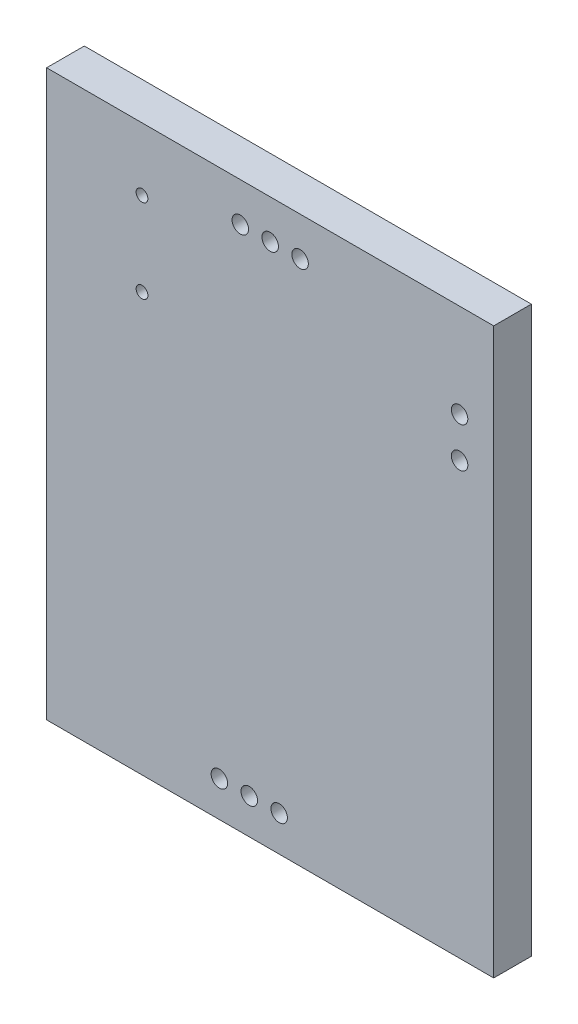
ISO-10303-21;
HEADER;
FILE_DESCRIPTION(('STEP AP214'),'2;1');
FILE_NAME('part.step','',(''),(''),'','','');
FILE_SCHEMA(('AUTOMOTIVE_DESIGN { 1 0 10303 214 1 1 1 1 }'));
ENDSEC;
DATA;
#1=APPLICATION_CONTEXT('core data for automotive mechanical design processes');
#2=APPLICATION_PROTOCOL_DEFINITION('international standard','automotive_design',2000,#1);
#3=PRODUCT_CONTEXT('',#1,'mechanical');
#4=PRODUCT('Part','Part','',(#3));
#5=PRODUCT_RELATED_PRODUCT_CATEGORY('part','',(#4));
#6=PRODUCT_DEFINITION_FORMATION('','',#4);
#7=PRODUCT_DEFINITION_CONTEXT('part definition',#1,'design');
#8=PRODUCT_DEFINITION('design','',#6,#7);
#9=PRODUCT_DEFINITION_SHAPE('','',#8);
#10=(LENGTH_UNIT() NAMED_UNIT(*) SI_UNIT(.MILLI.,.METRE.));
#11=(NAMED_UNIT(*) PLANE_ANGLE_UNIT() SI_UNIT($,.RADIAN.));
#12=(NAMED_UNIT(*) SI_UNIT($,.STERADIAN.) SOLID_ANGLE_UNIT());
#13=UNCERTAINTY_MEASURE_WITH_UNIT(LENGTH_MEASURE(1.E-05),#10,'distance_accuracy_value','');
#14=(GEOMETRIC_REPRESENTATION_CONTEXT(3) GLOBAL_UNCERTAINTY_ASSIGNED_CONTEXT((#13)) GLOBAL_UNIT_ASSIGNED_CONTEXT((#10,
#11,#12)) REPRESENTATION_CONTEXT('',''));
#15=CARTESIAN_POINT('',(0.,0.,0.));
#16=DIRECTION('',(0.,0.,1.));
#17=DIRECTION('',(1.,0.,0.));
#18=AXIS2_PLACEMENT_3D('',#15,#16,#17);
#19=CARTESIAN_POINT('',(19.668039116078,-21.2632029464,1.600050800102));
#20=DIRECTION('',(0.,0.,-1.));
#21=DIRECTION('',(-1.,0.,0.));
#22=AXIS2_PLACEMENT_3D('',#19,#20,#21);
#23=PLANE('',#22);
#24=CARTESIAN_POINT('',(27.714503429007,-14.94716789433,1.600050800102));
#25=DIRECTION('',(0.,0.,-1.));
#26=DIRECTION('',(-1.,0.,0.));
#27=AXIS2_PLACEMENT_3D('',#24,#25,#26);
#28=CIRCLE('',#27,0.350012700025);
#29=CARTESIAN_POINT('',(27.364490728982,-14.94716789433,1.600050800102));
#30=VERTEX_POINT('',#29);
#31=EDGE_CURVE('E108',#30,#30,#28,.T.);
#32=ORIENTED_EDGE('',*,*,#31,.T.);
#33=EDGE_LOOP('',(#32));
#34=FACE_BOUND('',#33,.T.);
#35=CARTESIAN_POINT('',(27.714503429007,-13.24714249428,1.600050800102));
#36=DIRECTION('',(0.,0.,-1.));
#37=DIRECTION('',(-1.,0.,0.));
#38=AXIS2_PLACEMENT_3D('',#35,#36,#37);
#39=CIRCLE('',#38,0.350012700025);
#40=CARTESIAN_POINT('',(27.364490728982,-13.24714249428,1.600050800102));
#41=VERTEX_POINT('',#40);
#42=EDGE_CURVE('E112',#41,#41,#39,.T.);
#43=ORIENTED_EDGE('',*,*,#42,.T.);
#44=EDGE_LOOP('',(#43));
#45=FACE_BOUND('',#44,.T.);
#46=CARTESIAN_POINT('',(20.939057658115,-10.92202184404,1.600050800102));
#47=DIRECTION('',(0.,0.,-1.));
#48=DIRECTION('',(-1.,0.,0.));
#49=AXIS2_PLACEMENT_3D('',#46,#47,#48);
#50=CIRCLE('',#49,0.350012700025);
#51=CARTESIAN_POINT('',(20.58904495809,-10.92202184404,1.600050800102));
#52=VERTEX_POINT('',#51);
#53=EDGE_CURVE('E115',#52,#52,#50,.T.);
#54=ORIENTED_EDGE('',*,*,#53,.T.);
#55=EDGE_LOOP('',(#54));
#56=FACE_BOUND('',#55,.T.);
#57=CARTESIAN_POINT('',(20.0508001016,-31.75006350012,1.600050800102));
#58=DIRECTION('',(0.,0.,-1.));
#59=DIRECTION('',(-1.,0.,0.));
#60=AXIS2_PLACEMENT_3D('',#57,#58,#59);
#61=CIRCLE('',#60,0.350012700025);
#62=CARTESIAN_POINT('',(19.700787401575,-31.75006350012,1.600050800102));
#63=VERTEX_POINT('',#62);
#64=EDGE_CURVE('E118',#63,#63,#61,.T.);
#65=ORIENTED_EDGE('',*,*,#64,.T.);
#66=EDGE_LOOP('',(#65));
#67=FACE_BOUND('',#66,.T.);
#68=CARTESIAN_POINT('',(19.66905511811,-10.92202184404,1.600050800102));
#69=DIRECTION('',(0.,0.,-1.));
#70=DIRECTION('',(-1.,0.,0.));
#71=AXIS2_PLACEMENT_3D('',#68,#69,#70);
#72=CIRCLE('',#71,0.350012700025);
#73=CARTESIAN_POINT('',(19.319042418085,-10.92202184404,1.600050800102));
#74=VERTEX_POINT('',#73);
#75=EDGE_CURVE('E121',#74,#74,#72,.T.);
#76=ORIENTED_EDGE('',*,*,#75,.T.);
#77=EDGE_LOOP('',(#76));
#78=FACE_BOUND('',#77,.T.);
#79=CARTESIAN_POINT('',(18.780797561595,-31.75006350012,1.600050800102));
#80=DIRECTION('',(0.,0.,-1.));
#81=DIRECTION('',(-1.,0.,0.));
#82=AXIS2_PLACEMENT_3D('',#79,#80,#81);
#83=CIRCLE('',#82,0.350012700025);
#84=CARTESIAN_POINT('',(18.43078486157,-31.75006350012,1.600050800102));
#85=VERTEX_POINT('',#84);
#86=EDGE_CURVE('E124',#85,#85,#83,.T.);
#87=ORIENTED_EDGE('',*,*,#86,.T.);
#88=EDGE_LOOP('',(#87));
#89=FACE_BOUND('',#88,.T.);
#90=CARTESIAN_POINT('',(18.399052578105,-10.92202184404,1.600050800102));
#91=DIRECTION('',(0.,0.,-1.));
#92=DIRECTION('',(-1.,0.,0.));
#93=AXIS2_PLACEMENT_3D('',#90,#91,#92);
#94=CIRCLE('',#93,0.350012700025);
#95=CARTESIAN_POINT('',(18.04903987808,-10.92202184404,1.600050800102));
#96=VERTEX_POINT('',#95);
#97=EDGE_CURVE('E127',#96,#96,#94,.T.);
#98=ORIENTED_EDGE('',*,*,#97,.T.);
#99=EDGE_LOOP('',(#98));
#100=FACE_BOUND('',#99,.T.);
#101=CARTESIAN_POINT('',(17.51079502159,-31.75006350012,1.600050800102));
#102=DIRECTION('',(0.,0.,-1.));
#103=DIRECTION('',(-1.,0.,0.));
#104=AXIS2_PLACEMENT_3D('',#101,#102,#103);
#105=CIRCLE('',#104,0.350012700025);
#106=CARTESIAN_POINT('',(17.160782321565,-31.75006350012,1.600050800102));
#107=VERTEX_POINT('',#106);
#108=EDGE_CURVE('E130',#107,#107,#105,.T.);
#109=ORIENTED_EDGE('',*,*,#108,.T.);
#110=EDGE_LOOP('',(#109));
#111=FACE_BOUND('',#110,.T.);
#112=CARTESIAN_POINT('',(14.224028448057,-15.49403098806,1.600050800102));
#113=DIRECTION('',(0.,0.,-1.));
#114=DIRECTION('',(-1.,0.,0.));
#115=AXIS2_PLACEMENT_3D('',#112,#113,#114);
#116=CIRCLE('',#115,0.25);
#117=CARTESIAN_POINT('',(13.974028448057,-15.49403098806,1.600050800102));
#118=VERTEX_POINT('',#117);
#119=EDGE_CURVE('E132',#118,#118,#116,.T.);
#120=ORIENTED_EDGE('',*,*,#119,.T.);
#121=EDGE_LOOP('',(#120));
#122=FACE_BOUND('',#121,.T.);
#123=CARTESIAN_POINT('',(14.224028448057,-11.93802387604,1.600050800102));
#124=DIRECTION('',(0.,0.,-1.));
#125=DIRECTION('',(-1.,0.,0.));
#126=AXIS2_PLACEMENT_3D('',#123,#124,#125);
#127=CIRCLE('',#126,0.25);
#128=CARTESIAN_POINT('',(13.974028448057,-11.93802387604,1.600050800102));
#129=VERTEX_POINT('',#128);
#130=EDGE_CURVE('E20',#129,#129,#127,.T.);
#131=ORIENTED_EDGE('',*,*,#130,.T.);
#132=EDGE_LOOP('',(#131));
#133=FACE_BOUND('',#132,.T.);
#134=DIRECTION('',(0.,1.,0.));
#135=VECTOR('',#134,1.);
#136=CARTESIAN_POINT('',(10.172720345441,-33.25836677673,1.600050800102));
#137=LINE('',#136,#135);
#138=CARTESIAN_POINT('',(10.172720345441,-33.25836677673,1.600050800102));
#139=VERTEX_POINT('',#138);
#140=CARTESIAN_POINT('',(10.172720345441,-9.268039116078,1.600050800102));
#141=VERTEX_POINT('',#140);
#142=EDGE_CURVE('E70',#139,#141,#137,.T.);
#143=ORIENTED_EDGE('',*,*,#142,.F.);
#144=DIRECTION('',(1.,0.,0.));
#145=VECTOR('',#144,1.);
#146=CARTESIAN_POINT('',(29.163357886716,-33.25836677673,1.600050800102));
#147=LINE('',#146,#145);
#148=CARTESIAN_POINT('',(29.163357886716,-33.25836677673,1.600050800102));
#149=VERTEX_POINT('',#148);
#150=EDGE_CURVE('E55',#149,#139,#147,.F.);
#151=ORIENTED_EDGE('',*,*,#150,.F.);
#152=DIRECTION('',(0.,1.,0.));
#153=VECTOR('',#152,1.);
#154=CARTESIAN_POINT('',(29.163357886716,-9.268039116078,1.600050800102));
#155=LINE('',#154,#153);
#156=CARTESIAN_POINT('',(29.163357886716,-9.268039116078,1.600050800102));
#157=VERTEX_POINT('',#156);
#158=EDGE_CURVE('E60',#157,#149,#155,.F.);
#159=ORIENTED_EDGE('',*,*,#158,.F.);
#160=DIRECTION('',(1.,0.,0.));
#161=VECTOR('',#160,1.);
#162=CARTESIAN_POINT('',(10.172720345441,-9.268039116078,1.600050800102));
#163=LINE('',#162,#161);
#164=EDGE_CURVE('E139',#141,#157,#163,.T.);
#165=ORIENTED_EDGE('',*,*,#164,.F.);
#166=EDGE_LOOP('',(#143,#151,#159,#165));
#167=FACE_BOUND('',#166,.T.);
#168=ADVANCED_FACE('F17',(#34,#45,#56,#67,#78,#89,#100,#111,#122,#133,#167),#23,.F.);
#169=CARTESIAN_POINT('',(29.163357886716,-9.268039116078,0.));
#170=DIRECTION('',(1.,0.,0.));
#171=DIRECTION('',(0.,0.,-1.));
#172=AXIS2_PLACEMENT_3D('',#169,#170,#171);
#173=PLANE('',#172);
#174=DIRECTION('',(0.,0.,-1.));
#175=VECTOR('',#174,1.);
#176=CARTESIAN_POINT('',(29.163357886716,-33.25836677673,0.));
#177=LINE('',#176,#175);
#178=CARTESIAN_POINT('',(29.163357886716,-33.25836677673,0.));
#179=VERTEX_POINT('',#178);
#180=EDGE_CURVE('E62',#179,#149,#177,.F.);
#181=ORIENTED_EDGE('',*,*,#180,.F.);
#182=DIRECTION('',(0.,1.,0.));
#183=VECTOR('',#182,1.);
#184=CARTESIAN_POINT('',(29.163357886716,-21.2632029464,0.));
#185=LINE('',#184,#183);
#186=CARTESIAN_POINT('',(29.163357886716,-9.268039116078,0.));
#187=VERTEX_POINT('',#186);
#188=EDGE_CURVE('E111',#187,#179,#185,.F.);
#189=ORIENTED_EDGE('',*,*,#188,.F.);
#190=DIRECTION('',(0.,0.,1.));
#191=VECTOR('',#190,1.);
#192=CARTESIAN_POINT('',(29.163357886716,-9.268039116078,0.));
#193=LINE('',#192,#191);
#194=EDGE_CURVE('E65',#157,#187,#193,.F.);
#195=ORIENTED_EDGE('',*,*,#194,.F.);
#196=ORIENTED_EDGE('',*,*,#158,.T.);
#197=EDGE_LOOP('',(#181,#189,#195,#196));
#198=FACE_BOUND('',#197,.T.);
#199=ADVANCED_FACE('F61',(#198),#173,.T.);
#200=CARTESIAN_POINT('',(29.163357886716,-33.25836677673,0.));
#201=DIRECTION('',(0.,-1.,0.));
#202=DIRECTION('',(0.,0.,-1.));
#203=AXIS2_PLACEMENT_3D('',#200,#201,#202);
#204=PLANE('',#203);
#205=DIRECTION('',(0.,0.,1.));
#206=VECTOR('',#205,1.);
#207=CARTESIAN_POINT('',(10.172720345441,-33.25836677673,0.));
#208=LINE('',#207,#206);
#209=CARTESIAN_POINT('',(10.172720345441,-33.25836677673,0.));
#210=VERTEX_POINT('',#209);
#211=EDGE_CURVE('E72',#210,#139,#208,.T.);
#212=ORIENTED_EDGE('',*,*,#211,.F.);
#213=DIRECTION('',(-1.,0.,0.));
#214=VECTOR('',#213,1.);
#215=CARTESIAN_POINT('',(19.668039116078,-33.25836677673,0.));
#216=LINE('',#215,#214);
#217=EDGE_CURVE('E76',#179,#210,#216,.T.);
#218=ORIENTED_EDGE('',*,*,#217,.F.);
#219=ORIENTED_EDGE('',*,*,#180,.T.);
#220=ORIENTED_EDGE('',*,*,#150,.T.);
#221=EDGE_LOOP('',(#212,#218,#219,#220));
#222=FACE_BOUND('',#221,.T.);
#223=ADVANCED_FACE('F74',(#222),#204,.T.);
#224=CARTESIAN_POINT('',(10.172720345441,-33.25836677673,0.));
#225=DIRECTION('',(-1.,0.,0.));
#226=DIRECTION('',(0.,0.,1.));
#227=AXIS2_PLACEMENT_3D('',#224,#225,#226);
#228=PLANE('',#227);
#229=DIRECTION('',(0.,0.,1.));
#230=VECTOR('',#229,1.);
#231=CARTESIAN_POINT('',(10.172720345441,-9.268039116078,0.));
#232=LINE('',#231,#230);
#233=CARTESIAN_POINT('',(10.172720345441,-9.268039116078,0.));
#234=VERTEX_POINT('',#233);
#235=EDGE_CURVE('E35',#234,#141,#232,.T.);
#236=ORIENTED_EDGE('',*,*,#235,.F.);
#237=DIRECTION('',(0.,1.,0.));
#238=VECTOR('',#237,1.);
#239=CARTESIAN_POINT('',(10.172720345441,-21.2632029464,0.));
#240=LINE('',#239,#238);
#241=EDGE_CURVE('E150',#210,#234,#240,.T.);
#242=ORIENTED_EDGE('',*,*,#241,.F.);
#243=ORIENTED_EDGE('',*,*,#211,.T.);
#244=ORIENTED_EDGE('',*,*,#142,.T.);
#245=EDGE_LOOP('',(#236,#242,#243,#244));
#246=FACE_BOUND('',#245,.T.);
#247=ADVANCED_FACE('F148',(#246),#228,.T.);
#248=CARTESIAN_POINT('',(10.172720345441,-9.268039116078,0.));
#249=DIRECTION('',(0.,1.,0.));
#250=DIRECTION('',(0.,0.,1.));
#251=AXIS2_PLACEMENT_3D('',#248,#249,#250);
#252=PLANE('',#251);
#253=ORIENTED_EDGE('',*,*,#194,.T.);
#254=DIRECTION('',(-1.,0.,0.));
#255=VECTOR('',#254,1.);
#256=CARTESIAN_POINT('',(19.668039116078,-9.268039116078,0.));
#257=LINE('',#256,#255);
#258=EDGE_CURVE('E107',#234,#187,#257,.F.);
#259=ORIENTED_EDGE('',*,*,#258,.F.);
#260=ORIENTED_EDGE('',*,*,#235,.T.);
#261=ORIENTED_EDGE('',*,*,#164,.T.);
#262=EDGE_LOOP('',(#253,#259,#260,#261));
#263=FACE_BOUND('',#262,.T.);
#264=ADVANCED_FACE('F155',(#263),#252,.T.);
#265=CARTESIAN_POINT('',(14.224028448057,-11.93802387604,0.));
#266=DIRECTION('',(0.,0.,-1.));
#267=DIRECTION('',(-1.,0.,0.));
#268=AXIS2_PLACEMENT_3D('',#265,#266,#267);
#269=CYLINDRICAL_SURFACE('',#268,0.25);
#270=ORIENTED_EDGE('',*,*,#130,.F.);
#271=EDGE_LOOP('',(#270));
#272=FACE_BOUND('',#271,.T.);
#273=CARTESIAN_POINT('',(14.224028448057,-11.93802387604,0.));
#274=DIRECTION('',(0.,0.,-1.));
#275=DIRECTION('',(-1.,0.,0.));
#276=AXIS2_PLACEMENT_3D('',#273,#274,#275);
#277=CIRCLE('',#276,0.25);
#278=CARTESIAN_POINT('',(13.974028448057,-11.93802387604,0.));
#279=VERTEX_POINT('',#278);
#280=EDGE_CURVE('E104',#279,#279,#277,.F.);
#281=ORIENTED_EDGE('',*,*,#280,.F.);
#282=EDGE_LOOP('',(#281));
#283=FACE_BOUND('',#282,.T.);
#284=ADVANCED_FACE('F157',(#272,#283),#269,.F.);
#285=CARTESIAN_POINT('',(14.224028448057,-15.49403098806,0.));
#286=DIRECTION('',(0.,0.,-1.));
#287=DIRECTION('',(-1.,0.,0.));
#288=AXIS2_PLACEMENT_3D('',#285,#286,#287);
#289=CYLINDRICAL_SURFACE('',#288,0.25);
#290=ORIENTED_EDGE('',*,*,#119,.F.);
#291=EDGE_LOOP('',(#290));
#292=FACE_BOUND('',#291,.T.);
#293=CARTESIAN_POINT('',(14.224028448057,-15.49403098806,0.));
#294=DIRECTION('',(0.,0.,-1.));
#295=DIRECTION('',(-1.,0.,0.));
#296=AXIS2_PLACEMENT_3D('',#293,#294,#295);
#297=CIRCLE('',#296,0.25);
#298=CARTESIAN_POINT('',(13.974028448057,-15.49403098806,0.));
#299=VERTEX_POINT('',#298);
#300=EDGE_CURVE('E101',#299,#299,#297,.F.);
#301=ORIENTED_EDGE('',*,*,#300,.F.);
#302=EDGE_LOOP('',(#301));
#303=FACE_BOUND('',#302,.T.);
#304=ADVANCED_FACE('F164',(#292,#303),#289,.F.);
#305=CARTESIAN_POINT('',(17.51079502159,-31.75006350012,0.));
#306=DIRECTION('',(0.,0.,-1.));
#307=DIRECTION('',(-1.,0.,0.));
#308=AXIS2_PLACEMENT_3D('',#305,#306,#307);
#309=CYLINDRICAL_SURFACE('',#308,0.350012700025);
#310=ORIENTED_EDGE('',*,*,#108,.F.);
#311=EDGE_LOOP('',(#310));
#312=FACE_BOUND('',#311,.T.);
#313=CARTESIAN_POINT('',(17.51079502159,-31.75006350012,0.));
#314=DIRECTION('',(0.,0.,-1.));
#315=DIRECTION('',(-1.,0.,0.));
#316=AXIS2_PLACEMENT_3D('',#313,#314,#315);
#317=CIRCLE('',#316,0.350012700025);
#318=CARTESIAN_POINT('',(17.160782321565,-31.75006350012,0.));
#319=VERTEX_POINT('',#318);
#320=EDGE_CURVE('E98',#319,#319,#317,.F.);
#321=ORIENTED_EDGE('',*,*,#320,.F.);
#322=EDGE_LOOP('',(#321));
#323=FACE_BOUND('',#322,.T.);
#324=ADVANCED_FACE('F202',(#312,#323),#309,.F.);
#325=CARTESIAN_POINT('',(18.399052578105,-10.92202184404,0.));
#326=DIRECTION('',(0.,0.,-1.));
#327=DIRECTION('',(-1.,0.,0.));
#328=AXIS2_PLACEMENT_3D('',#325,#326,#327);
#329=CYLINDRICAL_SURFACE('',#328,0.350012700025);
#330=ORIENTED_EDGE('',*,*,#97,.F.);
#331=EDGE_LOOP('',(#330));
#332=FACE_BOUND('',#331,.T.);
#333=CARTESIAN_POINT('',(18.399052578105,-10.92202184404,0.));
#334=DIRECTION('',(0.,0.,-1.));
#335=DIRECTION('',(-1.,0.,0.));
#336=AXIS2_PLACEMENT_3D('',#333,#334,#335);
#337=CIRCLE('',#336,0.350012700025);
#338=CARTESIAN_POINT('',(18.04903987808,-10.92202184404,0.));
#339=VERTEX_POINT('',#338);
#340=EDGE_CURVE('E95',#339,#339,#337,.F.);
#341=ORIENTED_EDGE('',*,*,#340,.F.);
#342=EDGE_LOOP('',(#341));
#343=FACE_BOUND('',#342,.T.);
#344=ADVANCED_FACE('F198',(#332,#343),#329,.F.);
#345=CARTESIAN_POINT('',(18.780797561595,-31.75006350012,0.));
#346=DIRECTION('',(0.,0.,-1.));
#347=DIRECTION('',(-1.,0.,0.));
#348=AXIS2_PLACEMENT_3D('',#345,#346,#347);
#349=CYLINDRICAL_SURFACE('',#348,0.350012700025);
#350=ORIENTED_EDGE('',*,*,#86,.F.);
#351=EDGE_LOOP('',(#350));
#352=FACE_BOUND('',#351,.T.);
#353=CARTESIAN_POINT('',(18.780797561595,-31.75006350012,0.));
#354=DIRECTION('',(0.,0.,-1.));
#355=DIRECTION('',(-1.,0.,0.));
#356=AXIS2_PLACEMENT_3D('',#353,#354,#355);
#357=CIRCLE('',#356,0.350012700025);
#358=CARTESIAN_POINT('',(18.43078486157,-31.75006350012,0.));
#359=VERTEX_POINT('',#358);
#360=EDGE_CURVE('E92',#359,#359,#357,.F.);
#361=ORIENTED_EDGE('',*,*,#360,.F.);
#362=EDGE_LOOP('',(#361));
#363=FACE_BOUND('',#362,.T.);
#364=ADVANCED_FACE('F194',(#352,#363),#349,.F.);
#365=CARTESIAN_POINT('',(19.66905511811,-10.92202184404,0.));
#366=DIRECTION('',(0.,0.,-1.));
#367=DIRECTION('',(-1.,0.,0.));
#368=AXIS2_PLACEMENT_3D('',#365,#366,#367);
#369=CYLINDRICAL_SURFACE('',#368,0.350012700025);
#370=ORIENTED_EDGE('',*,*,#75,.F.);
#371=EDGE_LOOP('',(#370));
#372=FACE_BOUND('',#371,.T.);
#373=CARTESIAN_POINT('',(19.66905511811,-10.92202184404,0.));
#374=DIRECTION('',(0.,0.,-1.));
#375=DIRECTION('',(-1.,0.,0.));
#376=AXIS2_PLACEMENT_3D('',#373,#374,#375);
#377=CIRCLE('',#376,0.350012700025);
#378=CARTESIAN_POINT('',(19.319042418085,-10.92202184404,0.));
#379=VERTEX_POINT('',#378);
#380=EDGE_CURVE('E89',#379,#379,#377,.F.);
#381=ORIENTED_EDGE('',*,*,#380,.F.);
#382=EDGE_LOOP('',(#381));
#383=FACE_BOUND('',#382,.T.);
#384=ADVANCED_FACE('F190',(#372,#383),#369,.F.);
#385=CARTESIAN_POINT('',(20.0508001016,-31.75006350012,0.));
#386=DIRECTION('',(0.,0.,-1.));
#387=DIRECTION('',(-1.,0.,0.));
#388=AXIS2_PLACEMENT_3D('',#385,#386,#387);
#389=CYLINDRICAL_SURFACE('',#388,0.350012700025);
#390=ORIENTED_EDGE('',*,*,#64,.F.);
#391=EDGE_LOOP('',(#390));
#392=FACE_BOUND('',#391,.T.);
#393=CARTESIAN_POINT('',(20.0508001016,-31.75006350012,0.));
#394=DIRECTION('',(0.,0.,-1.));
#395=DIRECTION('',(-1.,0.,0.));
#396=AXIS2_PLACEMENT_3D('',#393,#394,#395);
#397=CIRCLE('',#396,0.350012700025);
#398=CARTESIAN_POINT('',(19.700787401575,-31.75006350012,0.));
#399=VERTEX_POINT('',#398);
#400=EDGE_CURVE('E86',#399,#399,#397,.F.);
#401=ORIENTED_EDGE('',*,*,#400,.F.);
#402=EDGE_LOOP('',(#401));
#403=FACE_BOUND('',#402,.T.);
#404=ADVANCED_FACE('F186',(#392,#403),#389,.F.);
#405=CARTESIAN_POINT('',(20.939057658115,-10.92202184404,0.));
#406=DIRECTION('',(0.,0.,-1.));
#407=DIRECTION('',(-1.,0.,0.));
#408=AXIS2_PLACEMENT_3D('',#405,#406,#407);
#409=CYLINDRICAL_SURFACE('',#408,0.350012700025);
#410=ORIENTED_EDGE('',*,*,#53,.F.);
#411=EDGE_LOOP('',(#410));
#412=FACE_BOUND('',#411,.T.);
#413=CARTESIAN_POINT('',(20.939057658115,-10.92202184404,0.));
#414=DIRECTION('',(0.,0.,-1.));
#415=DIRECTION('',(-1.,0.,0.));
#416=AXIS2_PLACEMENT_3D('',#413,#414,#415);
#417=CIRCLE('',#416,0.350012700025);
#418=CARTESIAN_POINT('',(20.58904495809,-10.92202184404,0.));
#419=VERTEX_POINT('',#418);
#420=EDGE_CURVE('E83',#419,#419,#417,.F.);
#421=ORIENTED_EDGE('',*,*,#420,.F.);
#422=EDGE_LOOP('',(#421));
#423=FACE_BOUND('',#422,.T.);
#424=ADVANCED_FACE('F182',(#412,#423),#409,.F.);
#425=CARTESIAN_POINT('',(27.714503429007,-13.24714249428,0.));
#426=DIRECTION('',(0.,0.,-1.));
#427=DIRECTION('',(-1.,0.,0.));
#428=AXIS2_PLACEMENT_3D('',#425,#426,#427);
#429=CYLINDRICAL_SURFACE('',#428,0.350012700025);
#430=ORIENTED_EDGE('',*,*,#42,.F.);
#431=EDGE_LOOP('',(#430));
#432=FACE_BOUND('',#431,.T.);
#433=CARTESIAN_POINT('',(27.714503429007,-13.24714249428,0.));
#434=DIRECTION('',(0.,0.,-1.));
#435=DIRECTION('',(-1.,0.,0.));
#436=AXIS2_PLACEMENT_3D('',#433,#434,#435);
#437=CIRCLE('',#436,0.350012700025);
#438=CARTESIAN_POINT('',(27.364490728982,-13.24714249428,0.));
#439=VERTEX_POINT('',#438);
#440=EDGE_CURVE('E26',#439,#439,#437,.F.);
#441=ORIENTED_EDGE('',*,*,#440,.F.);
#442=EDGE_LOOP('',(#441));
#443=FACE_BOUND('',#442,.T.);
#444=ADVANCED_FACE('F175',(#432,#443),#429,.F.);
#445=CARTESIAN_POINT('',(27.714503429007,-14.94716789433,0.));
#446=DIRECTION('',(0.,0.,-1.));
#447=DIRECTION('',(-1.,0.,0.));
#448=AXIS2_PLACEMENT_3D('',#445,#446,#447);
#449=CYLINDRICAL_SURFACE('',#448,0.350012700025);
#450=ORIENTED_EDGE('',*,*,#31,.F.);
#451=EDGE_LOOP('',(#450));
#452=FACE_BOUND('',#451,.T.);
#453=CARTESIAN_POINT('',(27.714503429007,-14.94716789433,0.));
#454=DIRECTION('',(0.,0.,-1.));
#455=DIRECTION('',(-1.,0.,0.));
#456=AXIS2_PLACEMENT_3D('',#453,#454,#455);
#457=CIRCLE('',#456,0.350012700025);
#458=CARTESIAN_POINT('',(27.364490728982,-14.94716789433,0.));
#459=VERTEX_POINT('',#458);
#460=EDGE_CURVE('E11',#459,#459,#457,.F.);
#461=ORIENTED_EDGE('',*,*,#460,.F.);
#462=EDGE_LOOP('',(#461));
#463=FACE_BOUND('',#462,.T.);
#464=ADVANCED_FACE('F169',(#452,#463),#449,.F.);
#465=CARTESIAN_POINT('',(19.668039116078,-21.2632029464,0.));
#466=DIRECTION('',(0.,0.,-1.));
#467=DIRECTION('',(-1.,0.,0.));
#468=AXIS2_PLACEMENT_3D('',#465,#466,#467);
#469=PLANE('',#468);
#470=ORIENTED_EDGE('',*,*,#460,.T.);
#471=EDGE_LOOP('',(#470));
#472=FACE_BOUND('',#471,.T.);
#473=ORIENTED_EDGE('',*,*,#440,.T.);
#474=EDGE_LOOP('',(#473));
#475=FACE_BOUND('',#474,.T.);
#476=ORIENTED_EDGE('',*,*,#420,.T.);
#477=EDGE_LOOP('',(#476));
#478=FACE_BOUND('',#477,.T.);
#479=ORIENTED_EDGE('',*,*,#400,.T.);
#480=EDGE_LOOP('',(#479));
#481=FACE_BOUND('',#480,.T.);
#482=ORIENTED_EDGE('',*,*,#380,.T.);
#483=EDGE_LOOP('',(#482));
#484=FACE_BOUND('',#483,.T.);
#485=ORIENTED_EDGE('',*,*,#360,.T.);
#486=EDGE_LOOP('',(#485));
#487=FACE_BOUND('',#486,.T.);
#488=ORIENTED_EDGE('',*,*,#340,.T.);
#489=EDGE_LOOP('',(#488));
#490=FACE_BOUND('',#489,.T.);
#491=ORIENTED_EDGE('',*,*,#320,.T.);
#492=EDGE_LOOP('',(#491));
#493=FACE_BOUND('',#492,.T.);
#494=ORIENTED_EDGE('',*,*,#300,.T.);
#495=EDGE_LOOP('',(#494));
#496=FACE_BOUND('',#495,.T.);
#497=ORIENTED_EDGE('',*,*,#280,.T.);
#498=EDGE_LOOP('',(#497));
#499=FACE_BOUND('',#498,.T.);
#500=ORIENTED_EDGE('',*,*,#241,.T.);
#501=ORIENTED_EDGE('',*,*,#258,.T.);
#502=ORIENTED_EDGE('',*,*,#188,.T.);
#503=ORIENTED_EDGE('',*,*,#217,.T.);
#504=EDGE_LOOP('',(#500,#501,#502,#503));
#505=FACE_BOUND('',#504,.T.);
#506=ADVANCED_FACE('F153',(#472,#475,#478,#481,#484,#487,#490,#493,#496,#499,#505),#469,.T.);
#507=CLOSED_SHELL('',(#168,#199,#223,#247,#264,#284,#304,#324,#344,#364,#384,#404,#424,#444,
#464,#506));
#508=MANIFOLD_SOLID_BREP('B1',#507);
#509=ADVANCED_BREP_SHAPE_REPRESENTATION('',(#18,#508),#14);
#510=SHAPE_DEFINITION_REPRESENTATION(#9,#509);
ENDSEC;
END-ISO-10303-21;
